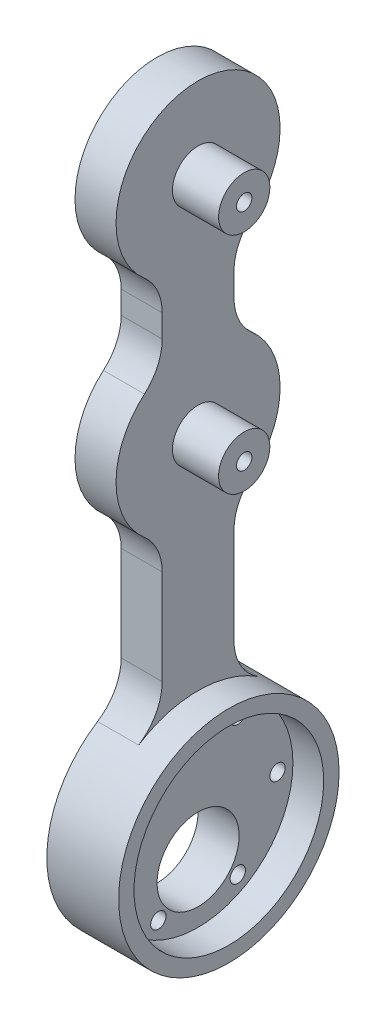
ISO-10303-21;
HEADER;
FILE_DESCRIPTION(('STEP AP214'),'2;1');
FILE_NAME('part.step','',(''),(''),'','','');
FILE_SCHEMA(('AUTOMOTIVE_DESIGN { 1 0 10303 214 1 1 1 1 }'));
ENDSEC;
DATA;
#1=APPLICATION_CONTEXT('core data for automotive mechanical design processes');
#2=APPLICATION_PROTOCOL_DEFINITION('international standard','automotive_design',2000,#1);
#3=PRODUCT_CONTEXT('',#1,'mechanical');
#4=PRODUCT('Part','Part','',(#3));
#5=PRODUCT_RELATED_PRODUCT_CATEGORY('part','',(#4));
#6=PRODUCT_DEFINITION_FORMATION('','',#4);
#7=PRODUCT_DEFINITION_CONTEXT('part definition',#1,'design');
#8=PRODUCT_DEFINITION('design','',#6,#7);
#9=PRODUCT_DEFINITION_SHAPE('','',#8);
#10=(LENGTH_UNIT() NAMED_UNIT(*) SI_UNIT(.MILLI.,.METRE.));
#11=(NAMED_UNIT(*) PLANE_ANGLE_UNIT() SI_UNIT($,.RADIAN.));
#12=(NAMED_UNIT(*) SI_UNIT($,.STERADIAN.) SOLID_ANGLE_UNIT());
#13=UNCERTAINTY_MEASURE_WITH_UNIT(LENGTH_MEASURE(1.E-05),#10,'distance_accuracy_value','');
#14=(GEOMETRIC_REPRESENTATION_CONTEXT(3) GLOBAL_UNCERTAINTY_ASSIGNED_CONTEXT((#13)) GLOBAL_UNIT_ASSIGNED_CONTEXT((#10,
#11,#12)) REPRESENTATION_CONTEXT('',''));
#15=CARTESIAN_POINT('',(0.,0.,0.));
#16=DIRECTION('',(0.,0.,1.));
#17=DIRECTION('',(1.,0.,0.));
#18=AXIS2_PLACEMENT_3D('',#15,#16,#17);
#19=CARTESIAN_POINT('',(4.,-43.7749891398763,0.));
#20=DIRECTION('',(1.,0.,0.));
#21=DIRECTION('',(0.,0.,-1.));
#22=AXIS2_PLACEMENT_3D('',#19,#20,#21);
#23=PLANE('',#22);
#24=CARTESIAN_POINT('',(4.,-43.7749891398763,0.));
#25=DIRECTION('',(1.,0.,0.));
#26=DIRECTION('',(0.,0.,-1.));
#27=AXIS2_PLACEMENT_3D('',#24,#25,#26);
#28=CIRCLE('',#27,5.);
#29=CARTESIAN_POINT('',(4.,-43.7749891398763,-5.));
#30=VERTEX_POINT('',#29);
#31=EDGE_CURVE('E314',#30,#30,#28,.T.);
#32=ORIENTED_EDGE('',*,*,#31,.F.);
#33=EDGE_LOOP('',(#32));
#34=FACE_BOUND('',#33,.T.);
#35=CARTESIAN_POINT('',(4.,0.,0.));
#36=DIRECTION('',(1.,0.,0.));
#37=DIRECTION('',(0.,0.,-1.));
#38=AXIS2_PLACEMENT_3D('',#35,#36,#37);
#39=CIRCLE('',#38,5.);
#40=CARTESIAN_POINT('',(4.,0.,-5.));
#41=VERTEX_POINT('',#40);
#42=EDGE_CURVE('E323',#41,#41,#39,.T.);
#43=ORIENTED_EDGE('',*,*,#42,.F.);
#44=EDGE_LOOP('',(#43));
#45=FACE_BOUND('',#44,.T.);
#46=CARTESIAN_POINT('',(4.,-43.7749891398763,0.));
#47=DIRECTION('',(1.,0.,0.));
#48=DIRECTION('',(0.,0.,-1.));
#49=AXIS2_PLACEMENT_3D('',#46,#47,#48);
#50=CIRCLE('',#49,16.);
#51=CARTESIAN_POINT('',(4.,-31.6689487873188,10.4615384615385));
#52=VERTEX_POINT('',#51);
#53=CARTESIAN_POINT('',(4.,-55.8810294924339,10.4615384615385));
#54=VERTEX_POINT('',#53);
#55=EDGE_CURVE('E157',#52,#54,#50,.T.);
#56=ORIENTED_EDGE('',*,*,#55,.T.);
#57=CARTESIAN_POINT('',(4.,-63.4473047127823,17.));
#58=DIRECTION('',(1.,0.,0.));
#59=DIRECTION('',(0.,0.,-1.));
#60=AXIS2_PLACEMENT_3D('',#57,#58,#59);
#61=CIRCLE('',#60,10.);
#62=CARTESIAN_POINT('',(4.,-63.4473047127823,6.99999999999999));
#63=VERTEX_POINT('',#62);
#64=EDGE_CURVE('E223',#54,#63,#61,.F.);
#65=ORIENTED_EDGE('',*,*,#64,.T.);
#66=DIRECTION('',(0.,-1.,0.));
#67=VECTOR('',#66,1.);
#68=CARTESIAN_POINT('',(4.,-58.1624837098145,7.));
#69=LINE('',#68,#67);
#70=CARTESIAN_POINT('',(4.,-81.9721738477184,6.99999999999999));
#71=VERTEX_POINT('',#70);
#72=EDGE_CURVE('E175',#63,#71,#69,.T.);
#73=ORIENTED_EDGE('',*,*,#72,.T.);
#74=CARTESIAN_POINT('',(4.,-81.9721738477184,17.));
#75=DIRECTION('',(1.,0.,0.));
#76=DIRECTION('',(0.,0.,-1.));
#77=AXIS2_PLACEMENT_3D('',#74,#75,#76);
#78=CIRCLE('',#77,10.);
#79=CARTESIAN_POINT('',(4.,-90.3908599468778,11.6031746031746));
#80=VERTEX_POINT('',#79);
#81=EDGE_CURVE('E227',#71,#80,#78,.F.);
#82=ORIENTED_EDGE('',*,*,#81,.T.);
#83=CARTESIAN_POINT('',(4.,-108.491035060071,0.));
#84=DIRECTION('',(1.,0.,0.));
#85=DIRECTION('',(0.,0.,-1.));
#86=AXIS2_PLACEMENT_3D('',#83,#84,#85);
#87=CIRCLE('',#86,21.5);
#88=CARTESIAN_POINT('',(4.,-90.3908599468778,-11.6031746031746));
#89=VERTEX_POINT('',#88);
#90=EDGE_CURVE('E296',#89,#80,#87,.T.);
#91=ORIENTED_EDGE('',*,*,#90,.F.);
#92=CARTESIAN_POINT('',(4.,-81.9721738477184,-17.));
#93=DIRECTION('',(1.,0.,0.));
#94=DIRECTION('',(0.,0.,-1.));
#95=AXIS2_PLACEMENT_3D('',#92,#93,#94);
#96=CIRCLE('',#95,10.);
#97=CARTESIAN_POINT('',(4.,-81.9721738477184,-6.99999999999999));
#98=VERTEX_POINT('',#97);
#99=EDGE_CURVE('E232',#89,#98,#96,.F.);
#100=ORIENTED_EDGE('',*,*,#99,.T.);
#101=DIRECTION('',(0.,-1.,0.));
#102=VECTOR('',#101,1.);
#103=CARTESIAN_POINT('',(4.,-58.1624837098145,-7.));
#104=LINE('',#103,#102);
#105=CARTESIAN_POINT('',(4.,-63.4473047127823,-6.99999999999999));
#106=VERTEX_POINT('',#105);
#107=EDGE_CURVE('E332',#106,#98,#104,.T.);
#108=ORIENTED_EDGE('',*,*,#107,.F.);
#109=CARTESIAN_POINT('',(4.,-63.4473047127823,-17.));
#110=DIRECTION('',(1.,0.,0.));
#111=DIRECTION('',(0.,0.,-1.));
#112=AXIS2_PLACEMENT_3D('',#109,#110,#111);
#113=CIRCLE('',#112,10.);
#114=CARTESIAN_POINT('',(4.,-55.8810294924339,-10.4615384615385));
#115=VERTEX_POINT('',#114);
#116=EDGE_CURVE('E236',#106,#115,#113,.F.);
#117=ORIENTED_EDGE('',*,*,#116,.T.);
#118=CARTESIAN_POINT('',(4.,-43.7749891398763,0.));
#119=DIRECTION('',(1.,0.,0.));
#120=DIRECTION('',(0.,0.,-1.));
#121=AXIS2_PLACEMENT_3D('',#118,#119,#120);
#122=CIRCLE('',#121,16.);
#123=CARTESIAN_POINT('',(4.,-31.6689487873188,-10.4615384615385));
#124=VERTEX_POINT('',#123);
#125=EDGE_CURVE('E335',#115,#124,#122,.T.);
#126=ORIENTED_EDGE('',*,*,#125,.T.);
#127=CARTESIAN_POINT('',(4.,-24.1026735669703,-17.));
#128=DIRECTION('',(1.,0.,0.));
#129=DIRECTION('',(0.,0.,-1.));
#130=AXIS2_PLACEMENT_3D('',#127,#128,#129);
#131=CIRCLE('',#130,10.);
#132=CARTESIAN_POINT('',(4.,-24.1026735669703,-7.));
#133=VERTEX_POINT('',#132);
#134=EDGE_CURVE('E240',#124,#133,#131,.F.);
#135=ORIENTED_EDGE('',*,*,#134,.T.);
#136=DIRECTION('',(0.,-1.,0.));
#137=VECTOR('',#136,1.);
#138=CARTESIAN_POINT('',(4.,-14.3874945699382,-7.));
#139=LINE('',#138,#137);
#140=CARTESIAN_POINT('',(4.,-19.672315572906,-7.));
#141=VERTEX_POINT('',#140);
#142=EDGE_CURVE('E250',#141,#133,#139,.T.);
#143=ORIENTED_EDGE('',*,*,#142,.F.);
#144=CARTESIAN_POINT('',(4.,-19.672315572906,-17.));
#145=DIRECTION('',(1.,0.,0.));
#146=DIRECTION('',(0.,0.,-1.));
#147=AXIS2_PLACEMENT_3D('',#144,#145,#146);
#148=CIRCLE('',#147,10.);
#149=CARTESIAN_POINT('',(4.,-12.1060403525575,-10.4615384615385));
#150=VERTEX_POINT('',#149);
#151=EDGE_CURVE('E49',#141,#150,#148,.F.);
#152=ORIENTED_EDGE('',*,*,#151,.T.);
#153=CARTESIAN_POINT('',(4.,0.,0.));
#154=DIRECTION('',(1.,0.,0.));
#155=DIRECTION('',(0.,0.,-1.));
#156=AXIS2_PLACEMENT_3D('',#153,#154,#155);
#157=CIRCLE('',#156,16.);
#158=CARTESIAN_POINT('',(4.,-12.1060403525575,10.4615384615385));
#159=VERTEX_POINT('',#158);
#160=EDGE_CURVE('E248',#150,#159,#157,.T.);
#161=ORIENTED_EDGE('',*,*,#160,.T.);
#162=CARTESIAN_POINT('',(4.,-19.672315572906,17.));
#163=DIRECTION('',(1.,0.,0.));
#164=DIRECTION('',(0.,0.,-1.));
#165=AXIS2_PLACEMENT_3D('',#162,#163,#164);
#166=CIRCLE('',#165,10.);
#167=CARTESIAN_POINT('',(4.,-19.672315572906,7.));
#168=VERTEX_POINT('',#167);
#169=EDGE_CURVE('E244',#159,#168,#166,.F.);
#170=ORIENTED_EDGE('',*,*,#169,.T.);
#171=DIRECTION('',(0.,-1.,0.));
#172=VECTOR('',#171,1.);
#173=CARTESIAN_POINT('',(4.,-14.3874945699382,7.));
#174=LINE('',#173,#172);
#175=CARTESIAN_POINT('',(4.,-24.1026735669703,7.));
#176=VERTEX_POINT('',#175);
#177=EDGE_CURVE('E159',#168,#176,#174,.T.);
#178=ORIENTED_EDGE('',*,*,#177,.T.);
#179=CARTESIAN_POINT('',(4.,-24.1026735669703,17.));
#180=DIRECTION('',(1.,0.,0.));
#181=DIRECTION('',(0.,0.,-1.));
#182=AXIS2_PLACEMENT_3D('',#179,#180,#181);
#183=CIRCLE('',#182,10.);
#184=EDGE_CURVE('E155',#176,#52,#183,.F.);
#185=ORIENTED_EDGE('',*,*,#184,.T.);
#186=EDGE_LOOP('',(#56,#65,#73,#82,#91,#100,#108,#117,#126,#135,#143,#152,#161,#170,#178,#185));
#187=FACE_BOUND('',#186,.T.);
#188=ADVANCED_FACE('F41',(#34,#45,#187),#23,.T.);
#189=CARTESIAN_POINT('',(-4.,-43.7749891398763,0.));
#190=DIRECTION('',(1.,0.,0.));
#191=DIRECTION('',(0.,0.,-1.));
#192=AXIS2_PLACEMENT_3D('',#189,#190,#191);
#193=CYLINDRICAL_SURFACE('',#192,16.);
#194=CARTESIAN_POINT('',(-4.,-43.7749891398763,0.));
#195=DIRECTION('',(1.,0.,0.));
#196=DIRECTION('',(0.,0.,-1.));
#197=AXIS2_PLACEMENT_3D('',#194,#195,#196);
#198=CIRCLE('',#197,16.);
#199=CARTESIAN_POINT('',(-4.,-31.6689487873188,10.4615384615385));
#200=VERTEX_POINT('',#199);
#201=CARTESIAN_POINT('',(-4.,-55.8810294924339,10.4615384615385));
#202=VERTEX_POINT('',#201);
#203=EDGE_CURVE('E340',#200,#202,#198,.T.);
#204=ORIENTED_EDGE('',*,*,#203,.T.);
#205=DIRECTION('',(1.,0.,0.));
#206=VECTOR('',#205,1.);
#207=CARTESIAN_POINT('',(-4.,-55.8810294924339,10.4615384615385));
#208=LINE('',#207,#206);
#209=EDGE_CURVE('E174',#202,#54,#208,.T.);
#210=ORIENTED_EDGE('',*,*,#209,.T.);
#211=ORIENTED_EDGE('',*,*,#55,.F.);
#212=DIRECTION('',(1.,0.,0.));
#213=VECTOR('',#212,1.);
#214=CARTESIAN_POINT('',(-4.,-31.6689487873188,10.4615384615385));
#215=LINE('',#214,#213);
#216=EDGE_CURVE('E171',#52,#200,#215,.F.);
#217=ORIENTED_EDGE('',*,*,#216,.T.);
#218=EDGE_LOOP('',(#204,#210,#211,#217));
#219=FACE_BOUND('',#218,.T.);
#220=ADVANCED_FACE('F170',(#219),#193,.T.);
#221=CARTESIAN_POINT('',(-4.,-14.3874945699382,7.));
#222=DIRECTION('',(0.,0.,1.));
#223=DIRECTION('',(0.,-1.,0.));
#224=AXIS2_PLACEMENT_3D('',#221,#222,#223);
#225=PLANE('',#224);
#226=DIRECTION('',(0.,-1.,0.));
#227=VECTOR('',#226,1.);
#228=CARTESIAN_POINT('',(-4.,-14.3874945699382,7.));
#229=LINE('',#228,#227);
#230=CARTESIAN_POINT('',(-4.,-19.672315572906,7.));
#231=VERTEX_POINT('',#230);
#232=CARTESIAN_POINT('',(-4.,-24.1026735669703,7.));
#233=VERTEX_POINT('',#232);
#234=EDGE_CURVE('E185',#231,#233,#229,.T.);
#235=ORIENTED_EDGE('',*,*,#234,.T.);
#236=DIRECTION('',(-1.,0.,0.));
#237=VECTOR('',#236,1.);
#238=CARTESIAN_POINT('',(4.,-24.1026735669703,7.));
#239=LINE('',#238,#237);
#240=EDGE_CURVE('E217',#233,#176,#239,.F.);
#241=ORIENTED_EDGE('',*,*,#240,.T.);
#242=ORIENTED_EDGE('',*,*,#177,.F.);
#243=DIRECTION('',(-1.,0.,0.));
#244=VECTOR('',#243,1.);
#245=CARTESIAN_POINT('',(-4.,-19.672315572906,7.));
#246=LINE('',#245,#244);
#247=EDGE_CURVE('E215',#168,#231,#246,.T.);
#248=ORIENTED_EDGE('',*,*,#247,.T.);
#249=EDGE_LOOP('',(#235,#241,#242,#248));
#250=FACE_BOUND('',#249,.T.);
#251=ADVANCED_FACE('F376',(#250),#225,.T.);
#252=CARTESIAN_POINT('',(-4.,0.,0.));
#253=DIRECTION('',(1.,0.,0.));
#254=DIRECTION('',(0.,0.,-1.));
#255=AXIS2_PLACEMENT_3D('',#252,#253,#254);
#256=CYLINDRICAL_SURFACE('',#255,16.);
#257=CARTESIAN_POINT('',(-4.,0.,0.));
#258=DIRECTION('',(1.,0.,0.));
#259=DIRECTION('',(0.,0.,-1.));
#260=AXIS2_PLACEMENT_3D('',#257,#258,#259);
#261=CIRCLE('',#260,16.);
#262=CARTESIAN_POINT('',(-4.,-12.1060403525575,-10.4615384615385));
#263=VERTEX_POINT('',#262);
#264=CARTESIAN_POINT('',(-4.,-12.1060403525575,10.4615384615385));
#265=VERTEX_POINT('',#264);
#266=EDGE_CURVE('E262',#263,#265,#261,.T.);
#267=ORIENTED_EDGE('',*,*,#266,.T.);
#268=DIRECTION('',(1.,0.,0.));
#269=VECTOR('',#268,1.);
#270=CARTESIAN_POINT('',(-4.,-12.1060403525575,10.4615384615385));
#271=LINE('',#270,#269);
#272=EDGE_CURVE('E220',#265,#159,#271,.T.);
#273=ORIENTED_EDGE('',*,*,#272,.T.);
#274=ORIENTED_EDGE('',*,*,#160,.F.);
#275=DIRECTION('',(1.,0.,0.));
#276=VECTOR('',#275,1.);
#277=CARTESIAN_POINT('',(-4.,-12.1060403525575,-10.4615384615385));
#278=LINE('',#277,#276);
#279=EDGE_CURVE('E63',#150,#263,#278,.F.);
#280=ORIENTED_EDGE('',*,*,#279,.T.);
#281=EDGE_LOOP('',(#267,#273,#274,#280));
#282=FACE_BOUND('',#281,.T.);
#283=ADVANCED_FACE('F253',(#282),#256,.T.);
#284=CARTESIAN_POINT('',(-4.,-14.3874945699382,-7.));
#285=DIRECTION('',(0.,0.,1.));
#286=DIRECTION('',(0.,-1.,0.));
#287=AXIS2_PLACEMENT_3D('',#284,#285,#286);
#288=PLANE('',#287);
#289=ORIENTED_EDGE('',*,*,#142,.T.);
#290=DIRECTION('',(1.,0.,0.));
#291=VECTOR('',#290,1.);
#292=CARTESIAN_POINT('',(-4.,-24.1026735669703,-7.));
#293=LINE('',#292,#291);
#294=CARTESIAN_POINT('',(-4.,-24.1026735669703,-7.));
#295=VERTEX_POINT('',#294);
#296=EDGE_CURVE('E213',#133,#295,#293,.F.);
#297=ORIENTED_EDGE('',*,*,#296,.T.);
#298=DIRECTION('',(0.,-1.,0.));
#299=VECTOR('',#298,1.);
#300=CARTESIAN_POINT('',(-4.,-14.3874945699382,-7.));
#301=LINE('',#300,#299);
#302=CARTESIAN_POINT('',(-4.,-19.672315572906,-7.));
#303=VERTEX_POINT('',#302);
#304=EDGE_CURVE('E260',#303,#295,#301,.T.);
#305=ORIENTED_EDGE('',*,*,#304,.F.);
#306=DIRECTION('',(1.,0.,0.));
#307=VECTOR('',#306,1.);
#308=CARTESIAN_POINT('',(-4.,-19.672315572906,-7.));
#309=LINE('',#308,#307);
#310=EDGE_CURVE('E210',#303,#141,#309,.T.);
#311=ORIENTED_EDGE('',*,*,#310,.T.);
#312=EDGE_LOOP('',(#289,#297,#305,#311));
#313=FACE_BOUND('',#312,.T.);
#314=ADVANCED_FACE('F264',(#313),#288,.F.);
#315=CARTESIAN_POINT('',(-4.,-43.7749891398763,0.));
#316=DIRECTION('',(1.,0.,0.));
#317=DIRECTION('',(0.,0.,-1.));
#318=AXIS2_PLACEMENT_3D('',#315,#316,#317);
#319=CYLINDRICAL_SURFACE('',#318,16.);
#320=ORIENTED_EDGE('',*,*,#125,.F.);
#321=DIRECTION('',(1.,0.,0.));
#322=VECTOR('',#321,1.);
#323=CARTESIAN_POINT('',(-4.,-55.8810294924339,-10.4615384615385));
#324=LINE('',#323,#322);
#325=CARTESIAN_POINT('',(-4.,-55.8810294924339,-10.4615384615385));
#326=VERTEX_POINT('',#325);
#327=EDGE_CURVE('E208',#115,#326,#324,.F.);
#328=ORIENTED_EDGE('',*,*,#327,.T.);
#329=CARTESIAN_POINT('',(-4.,-43.7749891398763,0.));
#330=DIRECTION('',(1.,0.,0.));
#331=DIRECTION('',(0.,0.,-1.));
#332=AXIS2_PLACEMENT_3D('',#329,#330,#331);
#333=CIRCLE('',#332,16.);
#334=CARTESIAN_POINT('',(-4.,-31.6689487873188,-10.4615384615385));
#335=VERTEX_POINT('',#334);
#336=EDGE_CURVE('E266',#326,#335,#333,.T.);
#337=ORIENTED_EDGE('',*,*,#336,.T.);
#338=DIRECTION('',(1.,0.,0.));
#339=VECTOR('',#338,1.);
#340=CARTESIAN_POINT('',(-4.,-31.6689487873188,-10.4615384615385));
#341=LINE('',#340,#339);
#342=EDGE_CURVE('E205',#335,#124,#341,.T.);
#343=ORIENTED_EDGE('',*,*,#342,.T.);
#344=EDGE_LOOP('',(#320,#328,#337,#343));
#345=FACE_BOUND('',#344,.T.);
#346=ADVANCED_FACE('F476',(#345),#319,.T.);
#347=CARTESIAN_POINT('',(-4.,-58.1624837098145,-7.));
#348=DIRECTION('',(0.,0.,1.));
#349=DIRECTION('',(0.,-1.,0.));
#350=AXIS2_PLACEMENT_3D('',#347,#348,#349);
#351=PLANE('',#350);
#352=ORIENTED_EDGE('',*,*,#107,.T.);
#353=DIRECTION('',(1.,0.,0.));
#354=VECTOR('',#353,1.);
#355=CARTESIAN_POINT('',(-4.,-81.9721738477184,-6.99999999999999));
#356=LINE('',#355,#354);
#357=CARTESIAN_POINT('',(-4.,-81.9721738477184,-6.99999999999999));
#358=VERTEX_POINT('',#357);
#359=EDGE_CURVE('E203',#98,#358,#356,.F.);
#360=ORIENTED_EDGE('',*,*,#359,.T.);
#361=DIRECTION('',(0.,-1.,0.));
#362=VECTOR('',#361,1.);
#363=CARTESIAN_POINT('',(-4.,-58.1624837098145,-7.));
#364=LINE('',#363,#362);
#365=CARTESIAN_POINT('',(-4.,-63.4473047127823,-6.99999999999999));
#366=VERTEX_POINT('',#365);
#367=EDGE_CURVE('E270',#366,#358,#364,.T.);
#368=ORIENTED_EDGE('',*,*,#367,.F.);
#369=DIRECTION('',(1.,0.,0.));
#370=VECTOR('',#369,1.);
#371=CARTESIAN_POINT('',(-4.,-63.4473047127823,-6.99999999999999));
#372=LINE('',#371,#370);
#373=EDGE_CURVE('E200',#366,#106,#372,.T.);
#374=ORIENTED_EDGE('',*,*,#373,.T.);
#375=EDGE_LOOP('',(#352,#360,#368,#374));
#376=FACE_BOUND('',#375,.T.);
#377=ADVANCED_FACE('F479',(#376),#351,.F.);
#378=CARTESIAN_POINT('',(-4.,-108.491035060071,0.));
#379=DIRECTION('',(1.,0.,0.));
#380=DIRECTION('',(0.,0.,-1.));
#381=AXIS2_PLACEMENT_3D('',#378,#379,#380);
#382=CYLINDRICAL_SURFACE('',#381,21.5);
#383=ORIENTED_EDGE('',*,*,#90,.T.);
#384=DIRECTION('',(1.,0.,0.));
#385=VECTOR('',#384,1.);
#386=CARTESIAN_POINT('',(-4.,-90.3908599468778,11.6031746031746));
#387=LINE('',#386,#385);
#388=CARTESIAN_POINT('',(-4.,-90.3908599468778,11.6031746031746));
#389=VERTEX_POINT('',#388);
#390=EDGE_CURVE('E198',#80,#389,#387,.F.);
#391=ORIENTED_EDGE('',*,*,#390,.T.);
#392=CARTESIAN_POINT('',(-4.,-108.491035060071,0.));
#393=DIRECTION('',(1.,0.,0.));
#394=DIRECTION('',(0.,0.,-1.));
#395=AXIS2_PLACEMENT_3D('',#392,#393,#394);
#396=CIRCLE('',#395,21.5);
#397=CARTESIAN_POINT('',(-4.,-90.3908599468778,-11.6031746031746));
#398=VERTEX_POINT('',#397);
#399=EDGE_CURVE('E345',#389,#398,#396,.T.);
#400=ORIENTED_EDGE('',*,*,#399,.T.);
#401=DIRECTION('',(1.,0.,0.));
#402=VECTOR('',#401,1.);
#403=CARTESIAN_POINT('',(-4.,-90.3908599468778,-11.6031746031746));
#404=LINE('',#403,#402);
#405=EDGE_CURVE('E195',#398,#89,#404,.T.);
#406=ORIENTED_EDGE('',*,*,#405,.T.);
#407=EDGE_LOOP('',(#383,#391,#400,#406));
#408=FACE_BOUND('',#407,.T.);
#409=CARTESIAN_POINT('',(10.,-108.491035060071,0.));
#410=DIRECTION('',(1.,0.,0.));
#411=DIRECTION('',(0.,0.,-1.));
#412=AXIS2_PLACEMENT_3D('',#409,#410,#411);
#413=CIRCLE('',#412,21.5);
#414=CARTESIAN_POINT('',(10.,-108.491035060071,-21.5));
#415=VERTEX_POINT('',#414);
#416=EDGE_CURVE('E303',#415,#415,#413,.T.);
#417=ORIENTED_EDGE('',*,*,#416,.F.);
#418=EDGE_LOOP('',(#417));
#419=FACE_BOUND('',#418,.T.);
#420=ADVANCED_FACE('F360',(#408,#419),#382,.T.);
#421=CARTESIAN_POINT('',(-4.,-58.1624837098145,7.));
#422=DIRECTION('',(0.,0.,1.));
#423=DIRECTION('',(0.,-1.,0.));
#424=AXIS2_PLACEMENT_3D('',#421,#422,#423);
#425=PLANE('',#424);
#426=ORIENTED_EDGE('',*,*,#72,.F.);
#427=DIRECTION('',(-1.,0.,0.));
#428=VECTOR('',#427,1.);
#429=CARTESIAN_POINT('',(-4.,-63.4473047127823,7.));
#430=LINE('',#429,#428);
#431=CARTESIAN_POINT('',(-4.,-63.4473047127823,6.99999999999999));
#432=VERTEX_POINT('',#431);
#433=EDGE_CURVE('E193',#63,#432,#430,.T.);
#434=ORIENTED_EDGE('',*,*,#433,.T.);
#435=DIRECTION('',(0.,-1.,0.));
#436=VECTOR('',#435,1.);
#437=CARTESIAN_POINT('',(-4.,-58.1624837098145,7.));
#438=LINE('',#437,#436);
#439=CARTESIAN_POINT('',(-4.,-81.9721738477184,6.99999999999999));
#440=VERTEX_POINT('',#439);
#441=EDGE_CURVE('E342',#432,#440,#438,.T.);
#442=ORIENTED_EDGE('',*,*,#441,.T.);
#443=DIRECTION('',(-1.,0.,0.));
#444=VECTOR('',#443,1.);
#445=CARTESIAN_POINT('',(4.,-81.9721738477184,6.99999999999999));
#446=LINE('',#445,#444);
#447=EDGE_CURVE('E182',#440,#71,#446,.F.);
#448=ORIENTED_EDGE('',*,*,#447,.T.);
#449=EDGE_LOOP('',(#426,#434,#442,#448));
#450=FACE_BOUND('',#449,.T.);
#451=ADVANCED_FACE('F370',(#450),#425,.T.);
#452=CARTESIAN_POINT('',(-4.,-43.7749891398763,0.));
#453=DIRECTION('',(1.,0.,0.));
#454=DIRECTION('',(0.,0.,-1.));
#455=AXIS2_PLACEMENT_3D('',#452,#453,#454);
#456=PLANE('',#455);
#457=CARTESIAN_POINT('',(-4.,-121.911218288768,7.7481463996623));
#458=DIRECTION('',(-1.,0.,0.));
#459=DIRECTION('',(0.,0.,1.));
#460=AXIS2_PLACEMENT_3D('',#457,#458,#459);
#461=CIRCLE('',#460,1.50000000000001);
#462=CARTESIAN_POINT('',(-4.,-121.911218288768,9.24814639966231));
#463=VERTEX_POINT('',#462);
#464=EDGE_CURVE('E789',#463,#463,#461,.T.);
#465=ORIENTED_EDGE('',*,*,#464,.F.);
#466=EDGE_LOOP('',(#465));
#467=FACE_BOUND('',#466,.T.);
#468=CARTESIAN_POINT('',(-4.,-121.911218288768,-7.74814639966233));
#469=DIRECTION('',(-1.,0.,0.));
#470=DIRECTION('',(0.,0.,1.));
#471=AXIS2_PLACEMENT_3D('',#468,#469,#470);
#472=CIRCLE('',#471,1.50000000000002);
#473=CARTESIAN_POINT('',(-4.,-121.911218288768,-6.24814639966231));
#474=VERTEX_POINT('',#473);
#475=EDGE_CURVE('E786',#474,#474,#472,.T.);
#476=ORIENTED_EDGE('',*,*,#475,.F.);
#477=EDGE_LOOP('',(#476));
#478=FACE_BOUND('',#477,.T.);
#479=CARTESIAN_POINT('',(-4.,-108.491035060071,-15.4962927993246));
#480=DIRECTION('',(-1.,0.,0.));
#481=DIRECTION('',(0.,0.,1.));
#482=AXIS2_PLACEMENT_3D('',#479,#480,#481);
#483=CIRCLE('',#482,1.5);
#484=CARTESIAN_POINT('',(-4.,-108.491035060071,-13.9962927993246));
#485=VERTEX_POINT('',#484);
#486=EDGE_CURVE('E783',#485,#485,#483,.T.);
#487=ORIENTED_EDGE('',*,*,#486,.F.);
#488=EDGE_LOOP('',(#487));
#489=FACE_BOUND('',#488,.T.);
#490=CARTESIAN_POINT('',(-4.,-95.0708518313736,-7.74814639966231));
#491=DIRECTION('',(-1.,0.,0.));
#492=DIRECTION('',(0.,0.,1.));
#493=AXIS2_PLACEMENT_3D('',#490,#491,#492);
#494=CIRCLE('',#493,1.50000000000002);
#495=CARTESIAN_POINT('',(-4.,-95.0708518313736,-6.2481463996623));
#496=VERTEX_POINT('',#495);
#497=EDGE_CURVE('E778',#496,#496,#494,.T.);
#498=ORIENTED_EDGE('',*,*,#497,.F.);
#499=EDGE_LOOP('',(#498));
#500=FACE_BOUND('',#499,.T.);
#501=CARTESIAN_POINT('',(-4.,-95.0708518313736,7.74814639966233));
#502=DIRECTION('',(-1.,0.,0.));
#503=DIRECTION('',(0.,0.,1.));
#504=AXIS2_PLACEMENT_3D('',#501,#502,#503);
#505=CIRCLE('',#504,1.5);
#506=CARTESIAN_POINT('',(-4.,-95.0708518313736,9.24814639966233));
#507=VERTEX_POINT('',#506);
#508=EDGE_CURVE('E773',#507,#507,#505,.T.);
#509=ORIENTED_EDGE('',*,*,#508,.F.);
#510=EDGE_LOOP('',(#509));
#511=FACE_BOUND('',#510,.T.);
#512=CARTESIAN_POINT('',(-4.,-108.491035060071,15.4962927993246));
#513=DIRECTION('',(-1.,0.,0.));
#514=DIRECTION('',(0.,0.,1.));
#515=AXIS2_PLACEMENT_3D('',#512,#513,#514);
#516=CIRCLE('',#515,1.5);
#517=CARTESIAN_POINT('',(-4.,-108.491035060071,16.9962927993246));
#518=VERTEX_POINT('',#517);
#519=EDGE_CURVE('E771',#518,#518,#516,.T.);
#520=ORIENTED_EDGE('',*,*,#519,.F.);
#521=EDGE_LOOP('',(#520));
#522=FACE_BOUND('',#521,.T.);
#523=CARTESIAN_POINT('',(-4.,-115.491035060071,0.));
#524=DIRECTION('',(-1.,0.,0.));
#525=DIRECTION('',(0.,0.,1.));
#526=AXIS2_PLACEMENT_3D('',#523,#524,#525);
#527=CIRCLE('',#526,8.);
#528=CARTESIAN_POINT('',(-4.,-115.491035060071,8.00000000000001));
#529=VERTEX_POINT('',#528);
#530=EDGE_CURVE('E280',#529,#529,#527,.T.);
#531=ORIENTED_EDGE('',*,*,#530,.F.);
#532=EDGE_LOOP('',(#531));
#533=FACE_BOUND('',#532,.T.);
#534=CARTESIAN_POINT('',(-4.,0.,0.));
#535=DIRECTION('',(-1.,0.,0.));
#536=DIRECTION('',(0.,0.,1.));
#537=AXIS2_PLACEMENT_3D('',#534,#535,#536);
#538=CIRCLE('',#537,1.5);
#539=CARTESIAN_POINT('',(-4.,0.,1.5));
#540=VERTEX_POINT('',#539);
#541=EDGE_CURVE('E307',#540,#540,#538,.T.);
#542=ORIENTED_EDGE('',*,*,#541,.F.);
#543=EDGE_LOOP('',(#542));
#544=FACE_BOUND('',#543,.T.);
#545=CARTESIAN_POINT('',(-4.,-43.7749891398763,0.));
#546=DIRECTION('',(-1.,0.,0.));
#547=DIRECTION('',(0.,0.,1.));
#548=AXIS2_PLACEMENT_3D('',#545,#546,#547);
#549=CIRCLE('',#548,1.5);
#550=CARTESIAN_POINT('',(-4.,-43.7749891398763,1.5));
#551=VERTEX_POINT('',#550);
#552=EDGE_CURVE('E315',#551,#551,#549,.T.);
#553=ORIENTED_EDGE('',*,*,#552,.F.);
#554=EDGE_LOOP('',(#553));
#555=FACE_BOUND('',#554,.T.);
#556=ORIENTED_EDGE('',*,*,#203,.F.);
#557=CARTESIAN_POINT('',(-4.,-24.1026735669703,17.));
#558=DIRECTION('',(1.,0.,0.));
#559=DIRECTION('',(0.,0.,-1.));
#560=AXIS2_PLACEMENT_3D('',#557,#558,#559);
#561=CIRCLE('',#560,10.);
#562=EDGE_CURVE('E164',#200,#233,#561,.T.);
#563=ORIENTED_EDGE('',*,*,#562,.T.);
#564=ORIENTED_EDGE('',*,*,#234,.F.);
#565=CARTESIAN_POINT('',(-4.,-19.672315572906,17.));
#566=DIRECTION('',(1.,0.,0.));
#567=DIRECTION('',(0.,0.,-1.));
#568=AXIS2_PLACEMENT_3D('',#565,#566,#567);
#569=CIRCLE('',#568,10.);
#570=EDGE_CURVE('E56',#231,#265,#569,.T.);
#571=ORIENTED_EDGE('',*,*,#570,.T.);
#572=ORIENTED_EDGE('',*,*,#266,.F.);
#573=CARTESIAN_POINT('',(-4.,-19.672315572906,-17.));
#574=DIRECTION('',(1.,0.,0.));
#575=DIRECTION('',(0.,0.,-1.));
#576=AXIS2_PLACEMENT_3D('',#573,#574,#575);
#577=CIRCLE('',#576,10.);
#578=EDGE_CURVE('E11',#263,#303,#577,.T.);
#579=ORIENTED_EDGE('',*,*,#578,.T.);
#580=ORIENTED_EDGE('',*,*,#304,.T.);
#581=CARTESIAN_POINT('',(-4.,-24.1026735669703,-17.));
#582=DIRECTION('',(1.,0.,0.));
#583=DIRECTION('',(0.,0.,-1.));
#584=AXIS2_PLACEMENT_3D('',#581,#582,#583);
#585=CIRCLE('',#584,10.);
#586=EDGE_CURVE('E165',#295,#335,#585,.T.);
#587=ORIENTED_EDGE('',*,*,#586,.T.);
#588=ORIENTED_EDGE('',*,*,#336,.F.);
#589=CARTESIAN_POINT('',(-4.,-63.4473047127823,-17.));
#590=DIRECTION('',(1.,0.,0.));
#591=DIRECTION('',(0.,0.,-1.));
#592=AXIS2_PLACEMENT_3D('',#589,#590,#591);
#593=CIRCLE('',#592,10.);
#594=EDGE_CURVE('E238',#326,#366,#593,.T.);
#595=ORIENTED_EDGE('',*,*,#594,.T.);
#596=ORIENTED_EDGE('',*,*,#367,.T.);
#597=CARTESIAN_POINT('',(-4.,-81.9721738477184,-17.));
#598=DIRECTION('',(1.,0.,0.));
#599=DIRECTION('',(0.,0.,-1.));
#600=AXIS2_PLACEMENT_3D('',#597,#598,#599);
#601=CIRCLE('',#600,10.);
#602=EDGE_CURVE('E234',#358,#398,#601,.T.);
#603=ORIENTED_EDGE('',*,*,#602,.T.);
#604=ORIENTED_EDGE('',*,*,#399,.F.);
#605=CARTESIAN_POINT('',(-4.,-81.9721738477184,17.));
#606=DIRECTION('',(1.,0.,0.));
#607=DIRECTION('',(0.,0.,-1.));
#608=AXIS2_PLACEMENT_3D('',#605,#606,#607);
#609=CIRCLE('',#608,10.);
#610=EDGE_CURVE('E230',#389,#440,#609,.T.);
#611=ORIENTED_EDGE('',*,*,#610,.T.);
#612=ORIENTED_EDGE('',*,*,#441,.F.);
#613=CARTESIAN_POINT('',(-4.,-63.4473047127823,17.));
#614=DIRECTION('',(1.,0.,0.));
#615=DIRECTION('',(0.,0.,-1.));
#616=AXIS2_PLACEMENT_3D('',#613,#614,#615);
#617=CIRCLE('',#616,10.);
#618=EDGE_CURVE('E225',#432,#202,#617,.T.);
#619=ORIENTED_EDGE('',*,*,#618,.T.);
#620=EDGE_LOOP('',(#556,#563,#564,#571,#572,#579,#580,#587,#588,#595,#596,#603,#604,#611,#612,#619));
#621=FACE_BOUND('',#620,.T.);
#622=ADVANCED_FACE('F259',(#467,#478,#489,#500,#511,#522,#533,#544,#555,#621),#456,.F.);
#623=CARTESIAN_POINT('',(13.,0.,0.));
#624=DIRECTION('',(-1.,0.,0.));
#625=DIRECTION('',(0.,0.,1.));
#626=AXIS2_PLACEMENT_3D('',#623,#624,#625);
#627=CYLINDRICAL_SURFACE('',#626,5.);
#628=CARTESIAN_POINT('',(13.,0.,0.));
#629=DIRECTION('',(1.,0.,0.));
#630=DIRECTION('',(0.,0.,-1.));
#631=AXIS2_PLACEMENT_3D('',#628,#629,#630);
#632=CIRCLE('',#631,5.);
#633=CARTESIAN_POINT('',(13.,0.,-5.));
#634=VERTEX_POINT('',#633);
#635=EDGE_CURVE('E176',#634,#634,#632,.T.);
#636=ORIENTED_EDGE('',*,*,#635,.F.);
#637=EDGE_LOOP('',(#636));
#638=FACE_BOUND('',#637,.T.);
#639=ORIENTED_EDGE('',*,*,#42,.T.);
#640=EDGE_LOOP('',(#639));
#641=FACE_BOUND('',#640,.T.);
#642=ADVANCED_FACE('F451',(#638,#641),#627,.T.);
#643=CARTESIAN_POINT('',(13.,0.,0.));
#644=DIRECTION('',(1.,0.,0.));
#645=DIRECTION('',(0.,0.,-1.));
#646=AXIS2_PLACEMENT_3D('',#643,#644,#645);
#647=PLANE('',#646);
#648=CARTESIAN_POINT('',(13.,0.,0.));
#649=DIRECTION('',(1.,0.,0.));
#650=DIRECTION('',(0.,0.,-1.));
#651=AXIS2_PLACEMENT_3D('',#648,#649,#650);
#652=CIRCLE('',#651,1.5);
#653=CARTESIAN_POINT('',(13.,0.,-1.5));
#654=VERTEX_POINT('',#653);
#655=EDGE_CURVE('E310',#654,#654,#652,.F.);
#656=ORIENTED_EDGE('',*,*,#655,.T.);
#657=EDGE_LOOP('',(#656));
#658=FACE_BOUND('',#657,.T.);
#659=ORIENTED_EDGE('',*,*,#635,.T.);
#660=EDGE_LOOP('',(#659));
#661=FACE_BOUND('',#660,.T.);
#662=ADVANCED_FACE('F448',(#658,#661),#647,.T.);
#663=CARTESIAN_POINT('',(13.,-43.7749891398763,0.));
#664=DIRECTION('',(-1.,0.,0.));
#665=DIRECTION('',(0.,0.,1.));
#666=AXIS2_PLACEMENT_3D('',#663,#664,#665);
#667=CYLINDRICAL_SURFACE('',#666,5.);
#668=CARTESIAN_POINT('',(13.,-43.7749891398763,0.));
#669=DIRECTION('',(1.,0.,0.));
#670=DIRECTION('',(0.,0.,-1.));
#671=AXIS2_PLACEMENT_3D('',#668,#669,#670);
#672=CIRCLE('',#671,5.);
#673=CARTESIAN_POINT('',(13.,-43.7749891398763,-5.));
#674=VERTEX_POINT('',#673);
#675=EDGE_CURVE('E320',#674,#674,#672,.T.);
#676=ORIENTED_EDGE('',*,*,#675,.F.);
#677=EDGE_LOOP('',(#676));
#678=FACE_BOUND('',#677,.T.);
#679=ORIENTED_EDGE('',*,*,#31,.T.);
#680=EDGE_LOOP('',(#679));
#681=FACE_BOUND('',#680,.T.);
#682=ADVANCED_FACE('F444',(#678,#681),#667,.T.);
#683=CARTESIAN_POINT('',(13.,-43.7749891398763,0.));
#684=DIRECTION('',(1.,0.,0.));
#685=DIRECTION('',(0.,0.,-1.));
#686=AXIS2_PLACEMENT_3D('',#683,#684,#685);
#687=PLANE('',#686);
#688=CARTESIAN_POINT('',(13.,-43.7749891398763,0.));
#689=DIRECTION('',(1.,0.,0.));
#690=DIRECTION('',(0.,0.,-1.));
#691=AXIS2_PLACEMENT_3D('',#688,#689,#690);
#692=CIRCLE('',#691,1.5);
#693=CARTESIAN_POINT('',(13.,-43.7749891398763,-1.5));
#694=VERTEX_POINT('',#693);
#695=EDGE_CURVE('E311',#694,#694,#692,.F.);
#696=ORIENTED_EDGE('',*,*,#695,.T.);
#697=EDGE_LOOP('',(#696));
#698=FACE_BOUND('',#697,.T.);
#699=ORIENTED_EDGE('',*,*,#675,.T.);
#700=EDGE_LOOP('',(#699));
#701=FACE_BOUND('',#700,.T.);
#702=ADVANCED_FACE('F440',(#698,#701),#687,.T.);
#703=CARTESIAN_POINT('',(17.2426406871193,-43.7749891398763,0.));
#704=DIRECTION('',(-1.,0.,0.));
#705=DIRECTION('',(0.,0.,1.));
#706=AXIS2_PLACEMENT_3D('',#703,#704,#705);
#707=CYLINDRICAL_SURFACE('',#706,1.5);
#708=ORIENTED_EDGE('',*,*,#552,.T.);
#709=EDGE_LOOP('',(#708));
#710=FACE_BOUND('',#709,.T.);
#711=ORIENTED_EDGE('',*,*,#695,.F.);
#712=EDGE_LOOP('',(#711));
#713=FACE_BOUND('',#712,.T.);
#714=ADVANCED_FACE('F434',(#710,#713),#707,.F.);
#715=CARTESIAN_POINT('',(17.2426406871193,0.,0.));
#716=DIRECTION('',(-1.,0.,0.));
#717=DIRECTION('',(0.,0.,1.));
#718=AXIS2_PLACEMENT_3D('',#715,#716,#717);
#719=CYLINDRICAL_SURFACE('',#718,1.5);
#720=ORIENTED_EDGE('',*,*,#541,.T.);
#721=EDGE_LOOP('',(#720));
#722=FACE_BOUND('',#721,.T.);
#723=ORIENTED_EDGE('',*,*,#655,.F.);
#724=EDGE_LOOP('',(#723));
#725=FACE_BOUND('',#724,.T.);
#726=ADVANCED_FACE('F428',(#722,#725),#719,.F.);
#727=CARTESIAN_POINT('',(10.,-108.491035060071,0.));
#728=DIRECTION('',(-1.,0.,0.));
#729=DIRECTION('',(0.,0.,1.));
#730=AXIS2_PLACEMENT_3D('',#727,#728,#729);
#731=CYLINDRICAL_SURFACE('',#730,18.5);
#732=CARTESIAN_POINT('',(10.,-108.491035060071,0.));
#733=DIRECTION('',(1.,0.,0.));
#734=DIRECTION('',(0.,0.,-1.));
#735=AXIS2_PLACEMENT_3D('',#732,#733,#734);
#736=CIRCLE('',#735,18.5);
#737=CARTESIAN_POINT('',(10.,-108.491035060071,-18.5));
#738=VERTEX_POINT('',#737);
#739=EDGE_CURVE('E299',#738,#738,#736,.T.);
#740=ORIENTED_EDGE('',*,*,#739,.T.);
#741=EDGE_LOOP('',(#740));
#742=FACE_BOUND('',#741,.T.);
#743=CARTESIAN_POINT('',(4.,-108.491035060071,0.));
#744=DIRECTION('',(1.,0.,0.));
#745=DIRECTION('',(0.,0.,-1.));
#746=AXIS2_PLACEMENT_3D('',#743,#744,#745);
#747=CIRCLE('',#746,18.5);
#748=CARTESIAN_POINT('',(4.,-108.491035060071,-18.5));
#749=VERTEX_POINT('',#748);
#750=EDGE_CURVE('E180',#749,#749,#747,.F.);
#751=ORIENTED_EDGE('',*,*,#750,.T.);
#752=EDGE_LOOP('',(#751));
#753=FACE_BOUND('',#752,.T.);
#754=ADVANCED_FACE('F410',(#742,#753),#731,.F.);
#755=CARTESIAN_POINT('',(10.,0.,0.));
#756=DIRECTION('',(1.,0.,0.));
#757=DIRECTION('',(0.,0.,-1.));
#758=AXIS2_PLACEMENT_3D('',#755,#756,#757);
#759=PLANE('',#758);
#760=ORIENTED_EDGE('',*,*,#739,.F.);
#761=EDGE_LOOP('',(#760));
#762=FACE_BOUND('',#761,.T.);
#763=ORIENTED_EDGE('',*,*,#416,.T.);
#764=EDGE_LOOP('',(#763));
#765=FACE_BOUND('',#764,.T.);
#766=ADVANCED_FACE('F401',(#762,#765),#759,.T.);
#767=CARTESIAN_POINT('',(4.,-121.911218288768,7.7481463996623));
#768=DIRECTION('',(1.,0.,0.));
#769=DIRECTION('',(0.,0.,-1.));
#770=AXIS2_PLACEMENT_3D('',#767,#768,#769);
#771=CIRCLE('',#770,1.50000000000001);
#772=CARTESIAN_POINT('',(4.,-121.911218288768,6.24814639966229));
#773=VERTEX_POINT('',#772);
#774=EDGE_CURVE('E188',#773,#773,#771,.T.);
#775=ORIENTED_EDGE('',*,*,#774,.F.);
#776=EDGE_LOOP('',(#775));
#777=FACE_BOUND('',#776,.T.);
#778=CARTESIAN_POINT('',(4.,-121.911218288768,-7.74814639966233));
#779=DIRECTION('',(1.,0.,0.));
#780=DIRECTION('',(0.,0.,-1.));
#781=AXIS2_PLACEMENT_3D('',#778,#779,#780);
#782=CIRCLE('',#781,1.50000000000002);
#783=CARTESIAN_POINT('',(4.,-121.911218288768,-9.24814639966235));
#784=VERTEX_POINT('',#783);
#785=EDGE_CURVE('E291',#784,#784,#782,.T.);
#786=ORIENTED_EDGE('',*,*,#785,.F.);
#787=EDGE_LOOP('',(#786));
#788=FACE_BOUND('',#787,.T.);
#789=CARTESIAN_POINT('',(4.,-108.491035060071,-15.4962927993246));
#790=DIRECTION('',(1.,0.,0.));
#791=DIRECTION('',(0.,0.,-1.));
#792=AXIS2_PLACEMENT_3D('',#789,#790,#791);
#793=CIRCLE('',#792,1.5);
#794=CARTESIAN_POINT('',(4.,-108.491035060071,-16.9962927993246));
#795=VERTEX_POINT('',#794);
#796=EDGE_CURVE('E289',#795,#795,#793,.T.);
#797=ORIENTED_EDGE('',*,*,#796,.F.);
#798=EDGE_LOOP('',(#797));
#799=FACE_BOUND('',#798,.T.);
#800=CARTESIAN_POINT('',(4.,-95.0708518313736,-7.74814639966231));
#801=DIRECTION('',(1.,0.,0.));
#802=DIRECTION('',(0.,0.,-1.));
#803=AXIS2_PLACEMENT_3D('',#800,#801,#802);
#804=CIRCLE('',#803,1.50000000000002);
#805=CARTESIAN_POINT('',(4.,-95.0708518313736,-9.24814639966233));
#806=VERTEX_POINT('',#805);
#807=EDGE_CURVE('E286',#806,#806,#804,.T.);
#808=ORIENTED_EDGE('',*,*,#807,.F.);
#809=EDGE_LOOP('',(#808));
#810=FACE_BOUND('',#809,.T.);
#811=CARTESIAN_POINT('',(4.,-95.0708518313736,7.74814639966233));
#812=DIRECTION('',(1.,0.,0.));
#813=DIRECTION('',(0.,0.,-1.));
#814=AXIS2_PLACEMENT_3D('',#811,#812,#813);
#815=CIRCLE('',#814,1.5);
#816=CARTESIAN_POINT('',(4.,-95.0708518313736,6.24814639966233));
#817=VERTEX_POINT('',#816);
#818=EDGE_CURVE('E283',#817,#817,#815,.T.);
#819=ORIENTED_EDGE('',*,*,#818,.F.);
#820=EDGE_LOOP('',(#819));
#821=FACE_BOUND('',#820,.T.);
#822=CARTESIAN_POINT('',(4.,-108.491035060071,15.4962927993246));
#823=DIRECTION('',(1.,0.,0.));
#824=DIRECTION('',(0.,0.,-1.));
#825=AXIS2_PLACEMENT_3D('',#822,#823,#824);
#826=CIRCLE('',#825,1.5);
#827=CARTESIAN_POINT('',(4.,-108.491035060071,13.9962927993246));
#828=VERTEX_POINT('',#827);
#829=EDGE_CURVE('E279',#828,#828,#826,.T.);
#830=ORIENTED_EDGE('',*,*,#829,.F.);
#831=EDGE_LOOP('',(#830));
#832=FACE_BOUND('',#831,.T.);
#833=CARTESIAN_POINT('',(4.,-115.491035060071,0.));
#834=DIRECTION('',(1.,0.,0.));
#835=DIRECTION('',(0.,0.,-1.));
#836=AXIS2_PLACEMENT_3D('',#833,#834,#835);
#837=CIRCLE('',#836,8.);
#838=CARTESIAN_POINT('',(4.,-115.491035060071,-8.));
#839=VERTEX_POINT('',#838);
#840=EDGE_CURVE('E276',#839,#839,#837,.T.);
#841=ORIENTED_EDGE('',*,*,#840,.F.);
#842=EDGE_LOOP('',(#841));
#843=FACE_BOUND('',#842,.T.);
#844=ORIENTED_EDGE('',*,*,#750,.F.);
#845=EDGE_LOOP('',(#844));
#846=FACE_BOUND('',#845,.T.);
#847=ADVANCED_FACE('F390',(#777,#788,#799,#810,#821,#832,#843,#846),#23,.T.);
#848=CARTESIAN_POINT('',(32.6274169979695,-115.491035060071,0.));
#849=DIRECTION('',(-1.,0.,0.));
#850=DIRECTION('',(0.,0.,1.));
#851=AXIS2_PLACEMENT_3D('',#848,#849,#850);
#852=CYLINDRICAL_SURFACE('',#851,8.);
#853=ORIENTED_EDGE('',*,*,#840,.T.);
#854=EDGE_LOOP('',(#853));
#855=FACE_BOUND('',#854,.T.);
#856=ORIENTED_EDGE('',*,*,#530,.T.);
#857=EDGE_LOOP('',(#856));
#858=FACE_BOUND('',#857,.T.);
#859=ADVANCED_FACE('F400',(#855,#858),#852,.F.);
#860=CARTESIAN_POINT('',(32.6274169979695,-108.491035060071,15.4962927993246));
#861=DIRECTION('',(-1.,0.,0.));
#862=DIRECTION('',(0.,0.,1.));
#863=AXIS2_PLACEMENT_3D('',#860,#861,#862);
#864=CYLINDRICAL_SURFACE('',#863,1.5);
#865=ORIENTED_EDGE('',*,*,#829,.T.);
#866=EDGE_LOOP('',(#865));
#867=FACE_BOUND('',#866,.T.);
#868=ORIENTED_EDGE('',*,*,#519,.T.);
#869=EDGE_LOOP('',(#868));
#870=FACE_BOUND('',#869,.T.);
#871=ADVANCED_FACE('F407',(#867,#870),#864,.F.);
#872=CARTESIAN_POINT('',(32.6274169979695,-95.0708518313736,7.74814639966233));
#873=DIRECTION('',(-1.,0.,0.));
#874=DIRECTION('',(0.,0.,1.));
#875=AXIS2_PLACEMENT_3D('',#872,#873,#874);
#876=CYLINDRICAL_SURFACE('',#875,1.5);
#877=ORIENTED_EDGE('',*,*,#818,.T.);
#878=EDGE_LOOP('',(#877));
#879=FACE_BOUND('',#878,.T.);
#880=ORIENTED_EDGE('',*,*,#508,.T.);
#881=EDGE_LOOP('',(#880));
#882=FACE_BOUND('',#881,.T.);
#883=ADVANCED_FACE('F590',(#879,#882),#876,.F.);
#884=CARTESIAN_POINT('',(32.6274169979695,-95.0708518313736,-7.74814639966231));
#885=DIRECTION('',(-1.,0.,0.));
#886=DIRECTION('',(0.,0.,1.));
#887=AXIS2_PLACEMENT_3D('',#884,#885,#886);
#888=CYLINDRICAL_SURFACE('',#887,1.50000000000002);
#889=ORIENTED_EDGE('',*,*,#807,.T.);
#890=EDGE_LOOP('',(#889));
#891=FACE_BOUND('',#890,.T.);
#892=ORIENTED_EDGE('',*,*,#497,.T.);
#893=EDGE_LOOP('',(#892));
#894=FACE_BOUND('',#893,.T.);
#895=ADVANCED_FACE('F580',(#891,#894),#888,.F.);
#896=CARTESIAN_POINT('',(32.6274169979695,-108.491035060071,-15.4962927993246));
#897=DIRECTION('',(-1.,0.,0.));
#898=DIRECTION('',(0.,0.,1.));
#899=AXIS2_PLACEMENT_3D('',#896,#897,#898);
#900=CYLINDRICAL_SURFACE('',#899,1.5);
#901=ORIENTED_EDGE('',*,*,#796,.T.);
#902=EDGE_LOOP('',(#901));
#903=FACE_BOUND('',#902,.T.);
#904=ORIENTED_EDGE('',*,*,#486,.T.);
#905=EDGE_LOOP('',(#904));
#906=FACE_BOUND('',#905,.T.);
#907=ADVANCED_FACE('F571',(#903,#906),#900,.F.);
#908=CARTESIAN_POINT('',(32.6274169979695,-121.911218288768,-7.74814639966233));
#909=DIRECTION('',(-1.,0.,0.));
#910=DIRECTION('',(0.,0.,1.));
#911=AXIS2_PLACEMENT_3D('',#908,#909,#910);
#912=CYLINDRICAL_SURFACE('',#911,1.50000000000002);
#913=ORIENTED_EDGE('',*,*,#785,.T.);
#914=EDGE_LOOP('',(#913));
#915=FACE_BOUND('',#914,.T.);
#916=ORIENTED_EDGE('',*,*,#475,.T.);
#917=EDGE_LOOP('',(#916));
#918=FACE_BOUND('',#917,.T.);
#919=ADVANCED_FACE('F562',(#915,#918),#912,.F.);
#920=CARTESIAN_POINT('',(32.6274169979695,-121.911218288768,7.7481463996623));
#921=DIRECTION('',(-1.,0.,0.));
#922=DIRECTION('',(0.,0.,1.));
#923=AXIS2_PLACEMENT_3D('',#920,#921,#922);
#924=CYLINDRICAL_SURFACE('',#923,1.50000000000001);
#925=ORIENTED_EDGE('',*,*,#774,.T.);
#926=EDGE_LOOP('',(#925));
#927=FACE_BOUND('',#926,.T.);
#928=ORIENTED_EDGE('',*,*,#464,.T.);
#929=EDGE_LOOP('',(#928));
#930=FACE_BOUND('',#929,.T.);
#931=ADVANCED_FACE('F487',(#927,#930),#924,.F.);
#932=CARTESIAN_POINT('',(-4.,-63.4473047127823,17.));
#933=DIRECTION('',(1.,0.,0.));
#934=DIRECTION('',(0.,0.,-1.));
#935=AXIS2_PLACEMENT_3D('',#932,#933,#934);
#936=CYLINDRICAL_SURFACE('',#935,10.);
#937=ORIENTED_EDGE('',*,*,#618,.F.);
#938=ORIENTED_EDGE('',*,*,#433,.F.);
#939=ORIENTED_EDGE('',*,*,#64,.F.);
#940=ORIENTED_EDGE('',*,*,#209,.F.);
#941=EDGE_LOOP('',(#937,#938,#939,#940));
#942=FACE_BOUND('',#941,.T.);
#943=ADVANCED_FACE('F374',(#942),#936,.F.);
#944=CARTESIAN_POINT('',(-4.,-81.9721738477184,17.));
#945=DIRECTION('',(1.,0.,0.));
#946=DIRECTION('',(0.,0.,-1.));
#947=AXIS2_PLACEMENT_3D('',#944,#945,#946);
#948=CYLINDRICAL_SURFACE('',#947,10.);
#949=ORIENTED_EDGE('',*,*,#610,.F.);
#950=ORIENTED_EDGE('',*,*,#390,.F.);
#951=ORIENTED_EDGE('',*,*,#81,.F.);
#952=ORIENTED_EDGE('',*,*,#447,.F.);
#953=EDGE_LOOP('',(#949,#950,#951,#952));
#954=FACE_BOUND('',#953,.T.);
#955=ADVANCED_FACE('F367',(#954),#948,.F.);
#956=CARTESIAN_POINT('',(-4.,-81.9721738477184,-17.));
#957=DIRECTION('',(1.,0.,0.));
#958=DIRECTION('',(0.,0.,-1.));
#959=AXIS2_PLACEMENT_3D('',#956,#957,#958);
#960=CYLINDRICAL_SURFACE('',#959,10.);
#961=ORIENTED_EDGE('',*,*,#602,.F.);
#962=ORIENTED_EDGE('',*,*,#359,.F.);
#963=ORIENTED_EDGE('',*,*,#99,.F.);
#964=ORIENTED_EDGE('',*,*,#405,.F.);
#965=EDGE_LOOP('',(#961,#962,#963,#964));
#966=FACE_BOUND('',#965,.T.);
#967=ADVANCED_FACE('F358',(#966),#960,.F.);
#968=CARTESIAN_POINT('',(-4.,-63.4473047127823,-17.));
#969=DIRECTION('',(1.,0.,0.));
#970=DIRECTION('',(0.,0.,-1.));
#971=AXIS2_PLACEMENT_3D('',#968,#969,#970);
#972=CYLINDRICAL_SURFACE('',#971,10.);
#973=ORIENTED_EDGE('',*,*,#594,.F.);
#974=ORIENTED_EDGE('',*,*,#327,.F.);
#975=ORIENTED_EDGE('',*,*,#116,.F.);
#976=ORIENTED_EDGE('',*,*,#373,.F.);
#977=EDGE_LOOP('',(#973,#974,#975,#976));
#978=FACE_BOUND('',#977,.T.);
#979=ADVANCED_FACE('F492',(#978),#972,.F.);
#980=CARTESIAN_POINT('',(-4.,-24.1026735669703,-17.));
#981=DIRECTION('',(1.,0.,0.));
#982=DIRECTION('',(0.,0.,-1.));
#983=AXIS2_PLACEMENT_3D('',#980,#981,#982);
#984=CYLINDRICAL_SURFACE('',#983,10.);
#985=ORIENTED_EDGE('',*,*,#586,.F.);
#986=ORIENTED_EDGE('',*,*,#296,.F.);
#987=ORIENTED_EDGE('',*,*,#134,.F.);
#988=ORIENTED_EDGE('',*,*,#342,.F.);
#989=EDGE_LOOP('',(#985,#986,#987,#988));
#990=FACE_BOUND('',#989,.T.);
#991=ADVANCED_FACE('F385',(#990),#984,.F.);
#992=CARTESIAN_POINT('',(-4.,-24.1026735669703,17.));
#993=DIRECTION('',(1.,0.,0.));
#994=DIRECTION('',(0.,0.,-1.));
#995=AXIS2_PLACEMENT_3D('',#992,#993,#994);
#996=CYLINDRICAL_SURFACE('',#995,10.);
#997=ORIENTED_EDGE('',*,*,#562,.F.);
#998=ORIENTED_EDGE('',*,*,#216,.F.);
#999=ORIENTED_EDGE('',*,*,#184,.F.);
#1000=ORIENTED_EDGE('',*,*,#240,.F.);
#1001=EDGE_LOOP('',(#997,#998,#999,#1000));
#1002=FACE_BOUND('',#1001,.T.);
#1003=ADVANCED_FACE('F179',(#1002),#996,.F.);
#1004=CARTESIAN_POINT('',(-4.,-19.672315572906,17.));
#1005=DIRECTION('',(1.,0.,0.));
#1006=DIRECTION('',(0.,0.,-1.));
#1007=AXIS2_PLACEMENT_3D('',#1004,#1005,#1006);
#1008=CYLINDRICAL_SURFACE('',#1007,10.);
#1009=ORIENTED_EDGE('',*,*,#570,.F.);
#1010=ORIENTED_EDGE('',*,*,#247,.F.);
#1011=ORIENTED_EDGE('',*,*,#169,.F.);
#1012=ORIENTED_EDGE('',*,*,#272,.F.);
#1013=EDGE_LOOP('',(#1009,#1010,#1011,#1012));
#1014=FACE_BOUND('',#1013,.T.);
#1015=ADVANCED_FACE('F379',(#1014),#1008,.F.);
#1016=CARTESIAN_POINT('',(-4.,-19.672315572906,-17.));
#1017=DIRECTION('',(1.,0.,0.));
#1018=DIRECTION('',(0.,0.,-1.));
#1019=AXIS2_PLACEMENT_3D('',#1016,#1017,#1018);
#1020=CYLINDRICAL_SURFACE('',#1019,10.);
#1021=ORIENTED_EDGE('',*,*,#578,.F.);
#1022=ORIENTED_EDGE('',*,*,#279,.F.);
#1023=ORIENTED_EDGE('',*,*,#151,.F.);
#1024=ORIENTED_EDGE('',*,*,#310,.F.);
#1025=EDGE_LOOP('',(#1021,#1022,#1023,#1024));
#1026=FACE_BOUND('',#1025,.T.);
#1027=ADVANCED_FACE('F43',(#1026),#1020,.F.);
#1028=CLOSED_SHELL('',(#188,#220,#251,#283,#314,#346,#377,#420,#451,#622,#642,#662,#682,#702,
#714,#726,#754,#766,#847,#859,#871,#883,#895,#907,#919,#931,#943,#955,#967,#979,#991,#1003,
#1015,#1027));
#1029=MANIFOLD_SOLID_BREP('B2',#1028);
#1030=ADVANCED_BREP_SHAPE_REPRESENTATION('',(#18,#1029),#14);
#1031=SHAPE_DEFINITION_REPRESENTATION(#9,#1030);
ENDSEC;
END-ISO-10303-21;
